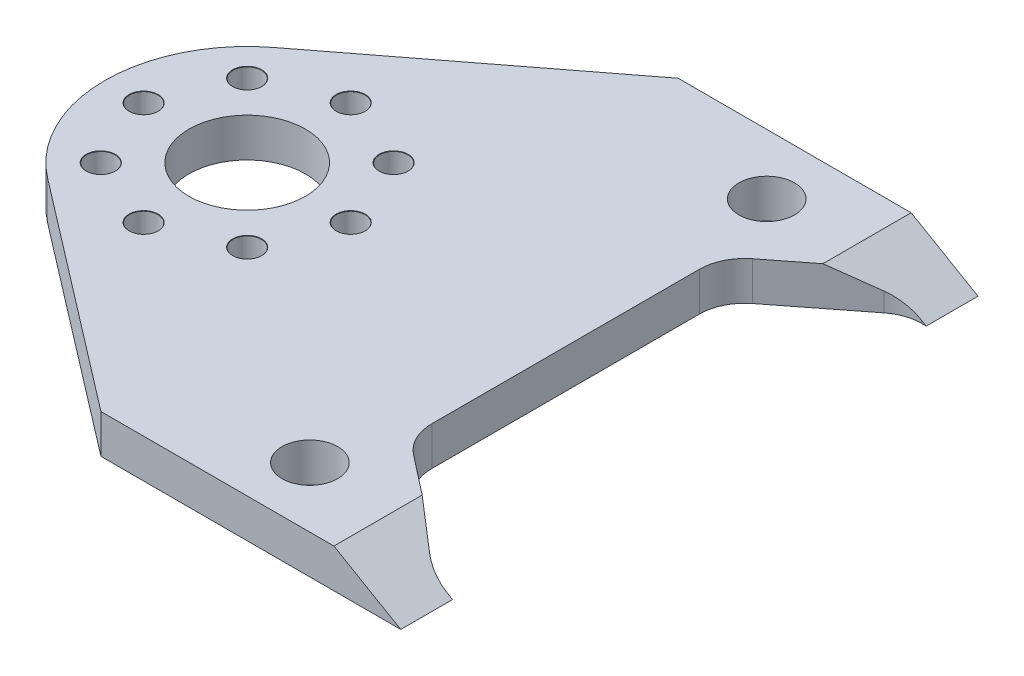
ISO-10303-21;
HEADER;
FILE_DESCRIPTION(('STEP AP214'),'2;1');
FILE_NAME('part.step','',(''),(''),'','','');
FILE_SCHEMA(('AUTOMOTIVE_DESIGN { 1 0 10303 214 1 1 1 1 }'));
ENDSEC;
DATA;
#1=APPLICATION_CONTEXT('core data for automotive mechanical design processes');
#2=APPLICATION_PROTOCOL_DEFINITION('international standard','automotive_design',2000,#1);
#3=PRODUCT_CONTEXT('',#1,'mechanical');
#4=PRODUCT('Part','Part','',(#3));
#5=PRODUCT_RELATED_PRODUCT_CATEGORY('part','',(#4));
#6=PRODUCT_DEFINITION_FORMATION('','',#4);
#7=PRODUCT_DEFINITION_CONTEXT('part definition',#1,'design');
#8=PRODUCT_DEFINITION('design','',#6,#7);
#9=PRODUCT_DEFINITION_SHAPE('','',#8);
#10=(LENGTH_UNIT() NAMED_UNIT(*) SI_UNIT(.MILLI.,.METRE.));
#11=(NAMED_UNIT(*) PLANE_ANGLE_UNIT() SI_UNIT($,.RADIAN.));
#12=(NAMED_UNIT(*) SI_UNIT($,.STERADIAN.) SOLID_ANGLE_UNIT());
#13=UNCERTAINTY_MEASURE_WITH_UNIT(LENGTH_MEASURE(1.E-05),#10,'distance_accuracy_value','');
#14=(GEOMETRIC_REPRESENTATION_CONTEXT(3) GLOBAL_UNCERTAINTY_ASSIGNED_CONTEXT((#13)) GLOBAL_UNIT_ASSIGNED_CONTEXT((#10,
#11,#12)) REPRESENTATION_CONTEXT('',''));
#15=CARTESIAN_POINT('',(0.,0.,0.));
#16=DIRECTION('',(0.,0.,1.));
#17=DIRECTION('',(1.,0.,0.));
#18=AXIS2_PLACEMENT_3D('',#15,#16,#17);
#19=CARTESIAN_POINT('',(0.,45.5,0.));
#20=DIRECTION('',(0.,-1.,0.));
#21=DIRECTION('',(0.,0.,-1.));
#22=AXIS2_PLACEMENT_3D('',#19,#20,#21);
#23=PLANE('',#22);
#24=CARTESIAN_POINT('',(-116.7,45.5,0.));
#25=DIRECTION('',(0.,-1.,0.));
#26=DIRECTION('',(0.,0.,-1.));
#27=AXIS2_PLACEMENT_3D('',#24,#25,#26);
#28=CIRCLE('',#27,4.5);
#29=CARTESIAN_POINT('',(-116.7,45.5,-4.5));
#30=VERTEX_POINT('',#29);
#31=EDGE_CURVE('E200',#30,#30,#28,.F.);
#32=ORIENTED_EDGE('',*,*,#31,.T.);
#33=EDGE_LOOP('',(#32));
#34=FACE_BOUND('',#33,.T.);
#35=DIRECTION('',(-1.,0.,0.));
#36=VECTOR('',#35,1.);
#37=CARTESIAN_POINT('',(0.,45.5,-22.3000000000002));
#38=LINE('',#37,#36);
#39=CARTESIAN_POINT('',(-82.5347874937353,45.5,-22.3000000000002));
#40=VERTEX_POINT('',#39);
#41=CARTESIAN_POINT('',(-105.7,45.5,-22.3000000000002));
#42=VERTEX_POINT('',#41);
#43=EDGE_CURVE('E169',#40,#42,#38,.T.);
#44=ORIENTED_EDGE('',*,*,#43,.F.);
#45=DIRECTION('',(0.,0.,1.));
#46=VECTOR('',#45,1.);
#47=CARTESIAN_POINT('',(-82.5347874937353,45.5,32.5));
#48=LINE('',#47,#46);
#49=CARTESIAN_POINT('',(-82.5347874937353,45.5,-18.2999999999999));
#50=VERTEX_POINT('',#49);
#51=EDGE_CURVE('E186',#40,#50,#48,.T.);
#52=ORIENTED_EDGE('',*,*,#51,.T.);
#53=DIRECTION('',(1.,0.,0.));
#54=VECTOR('',#53,1.);
#55=CARTESIAN_POINT('',(-49.7126326330275,45.5,-18.3));
#56=LINE('',#55,#54);
#57=CARTESIAN_POINT('',(-82.8873673669726,45.5,-18.2999999999999));
#58=VERTEX_POINT('',#57);
#59=EDGE_CURVE('E359',#58,#50,#56,.T.);
#60=ORIENTED_EDGE('',*,*,#59,.F.);
#61=CARTESIAN_POINT('',(-82.8873673669726,45.5,-14.7999999999999));
#62=DIRECTION('',(0.,-1.,0.));
#63=DIRECTION('',(0.,0.,-1.));
#64=AXIS2_PLACEMENT_3D('',#61,#62,#63);
#65=CIRCLE('',#64,3.5);
#66=CARTESIAN_POINT('',(-85.0421825306124,45.5,-17.5580376376235));
#67=VERTEX_POINT('',#66);
#68=EDGE_CURVE('E357',#67,#58,#65,.T.);
#69=ORIENTED_EDGE('',*,*,#68,.F.);
#70=DIRECTION('',(0.78801075360672,0.,-0.615661475325661));
#71=VECTOR('',#70,1.);
#72=CARTESIAN_POINT('',(-85.0421825306124,45.5,-17.5580376376235));
#73=LINE('',#72,#71);
#74=CARTESIAN_POINT('',(-90.7548151636398,45.5,-13.0948398719258));
#75=VERTEX_POINT('',#74);
#76=EDGE_CURVE('E355',#75,#67,#73,.T.);
#77=ORIENTED_EDGE('',*,*,#76,.F.);
#78=CARTESIAN_POINT('',(-88.6,45.5,-10.3368022343023));
#79=DIRECTION('',(0.,-1.,0.));
#80=DIRECTION('',(0.,0.,-1.));
#81=AXIS2_PLACEMENT_3D('',#78,#79,#80);
#82=CIRCLE('',#81,3.5);
#83=CARTESIAN_POINT('',(-92.1,45.5,-10.3368022343023));
#84=VERTEX_POINT('',#83);
#85=EDGE_CURVE('E353',#84,#75,#82,.T.);
#86=ORIENTED_EDGE('',*,*,#85,.F.);
#87=DIRECTION('',(0.,0.,-1.));
#88=VECTOR('',#87,1.);
#89=CARTESIAN_POINT('',(-92.1,45.5,-10.3368022343023));
#90=LINE('',#89,#88);
#91=CARTESIAN_POINT('',(-92.0999999999999,45.5,10.3368022343025));
#92=VERTEX_POINT('',#91);
#93=EDGE_CURVE('E351',#92,#84,#90,.T.);
#94=ORIENTED_EDGE('',*,*,#93,.F.);
#95=CARTESIAN_POINT('',(-88.6,45.5,10.3368022343025));
#96=DIRECTION('',(0.,-1.,0.));
#97=DIRECTION('',(0.,0.,-1.));
#98=AXIS2_PLACEMENT_3D('',#95,#96,#97);
#99=CIRCLE('',#98,3.49999999999999);
#100=CARTESIAN_POINT('',(-90.7548151636397,45.5,13.094839871926));
#101=VERTEX_POINT('',#100);
#102=EDGE_CURVE('E349',#101,#92,#99,.T.);
#103=ORIENTED_EDGE('',*,*,#102,.F.);
#104=DIRECTION('',(-0.788010753606724,0.,-0.615661475325656));
#105=VECTOR('',#104,1.);
#106=CARTESIAN_POINT('',(-90.7548151636398,45.5,13.094839871926));
#107=LINE('',#106,#105);
#108=CARTESIAN_POINT('',(-85.0421825306122,45.5,17.5580376376236));
#109=VERTEX_POINT('',#108);
#110=EDGE_CURVE('E347',#109,#101,#107,.T.);
#111=ORIENTED_EDGE('',*,*,#110,.F.);
#112=CARTESIAN_POINT('',(-82.8873673669724,45.5,14.8000000000001));
#113=DIRECTION('',(0.,-1.,0.));
#114=DIRECTION('',(0.,0.,-1.));
#115=AXIS2_PLACEMENT_3D('',#112,#113,#114);
#116=CIRCLE('',#115,3.5);
#117=CARTESIAN_POINT('',(-82.8873673669724,45.5,18.3000000000001));
#118=VERTEX_POINT('',#117);
#119=EDGE_CURVE('E185',#118,#109,#116,.T.);
#120=ORIENTED_EDGE('',*,*,#119,.F.);
#121=DIRECTION('',(-1.,0.,0.));
#122=VECTOR('',#121,1.);
#123=CARTESIAN_POINT('',(-82.8873673669724,45.5,18.3000000000001));
#124=LINE('',#123,#122);
#125=CARTESIAN_POINT('',(-82.5347874937353,45.5,18.3000000000001));
#126=VERTEX_POINT('',#125);
#127=EDGE_CURVE('E184',#126,#118,#124,.T.);
#128=ORIENTED_EDGE('',*,*,#127,.F.);
#129=DIRECTION('',(0.,0.,1.));
#130=VECTOR('',#129,1.);
#131=CARTESIAN_POINT('',(-82.5347874937353,45.5,32.5));
#132=LINE('',#131,#130);
#133=CARTESIAN_POINT('',(-82.5347874937353,45.5,22.3000000000001));
#134=VERTEX_POINT('',#133);
#135=EDGE_CURVE('E175',#126,#134,#132,.T.);
#136=ORIENTED_EDGE('',*,*,#135,.T.);
#137=DIRECTION('',(1.,0.,0.));
#138=VECTOR('',#137,1.);
#139=CARTESIAN_POINT('',(0.,45.5,22.2999999999998));
#140=LINE('',#139,#138);
#141=CARTESIAN_POINT('',(-105.7,45.5,22.3000000000001));
#142=VERTEX_POINT('',#141);
#143=EDGE_CURVE('E160',#142,#134,#140,.T.);
#144=ORIENTED_EDGE('',*,*,#143,.F.);
#145=DIRECTION('',(-0.793478788270874,0.,-0.608597907130961));
#146=VECTOR('',#145,1.);
#147=CARTESIAN_POINT('',(-105.7,45.5,22.3000000000001));
#148=LINE('',#147,#146);
#149=CARTESIAN_POINT('',(-123.39457697844,45.5,8.72826667097977));
#150=VERTEX_POINT('',#149);
#151=EDGE_CURVE('E255',#142,#150,#148,.T.);
#152=ORIENTED_EDGE('',*,*,#151,.T.);
#153=CARTESIAN_POINT('',(-116.7,45.5,0.));
#154=DIRECTION('',(0.,1.,0.));
#155=DIRECTION('',(0.,0.,1.));
#156=AXIS2_PLACEMENT_3D('',#153,#154,#155);
#157=CIRCLE('',#156,11.);
#158=CARTESIAN_POINT('',(-123.394576978441,45.5,-8.72826667097961));
#159=VERTEX_POINT('',#158);
#160=EDGE_CURVE('E327',#159,#150,#157,.T.);
#161=ORIENTED_EDGE('',*,*,#160,.F.);
#162=DIRECTION('',(0.793478788270873,0.,-0.608597907130962));
#163=VECTOR('',#162,1.);
#164=CARTESIAN_POINT('',(-105.7,45.5,-22.3000000000002));
#165=LINE('',#164,#163);
#166=EDGE_CURVE('E257',#159,#42,#165,.T.);
#167=ORIENTED_EDGE('',*,*,#166,.T.);
#168=EDGE_LOOP('',(#44,#52,#60,#69,#77,#86,#94,#103,#111,#120,#128,#136,#144,#152,#161,#167));
#169=FACE_BOUND('',#168,.T.);
#170=CARTESIAN_POINT('',(-94.2078962198904,45.5,-17.6479012936033));
#171=DIRECTION('',(0.,-1.,0.));
#172=DIRECTION('',(0.,0.,-1.));
#173=AXIS2_PLACEMENT_3D('',#170,#171,#172);
#174=CIRCLE('',#173,2.14999999999999);
#175=CARTESIAN_POINT('',(-94.2078962198904,45.5,-19.7979012936033));
#176=VERTEX_POINT('',#175);
#177=EDGE_CURVE('E197',#176,#176,#174,.F.);
#178=ORIENTED_EDGE('',*,*,#177,.T.);
#179=EDGE_LOOP('',(#178));
#180=FACE_BOUND('',#179,.T.);
#181=CARTESIAN_POINT('',(-94.2078962198904,45.5,17.6479012936032));
#182=DIRECTION('',(0.,-1.,0.));
#183=DIRECTION('',(0.,0.,-1.));
#184=AXIS2_PLACEMENT_3D('',#181,#182,#183);
#185=CIRCLE('',#184,2.14999999999999);
#186=CARTESIAN_POINT('',(-94.2078962198904,45.5,15.4979012936032));
#187=VERTEX_POINT('',#186);
#188=EDGE_CURVE('E191',#187,#187,#185,.F.);
#189=ORIENTED_EDGE('',*,*,#188,.T.);
#190=EDGE_LOOP('',(#189));
#191=FACE_BOUND('',#190,.T.);
#192=CARTESIAN_POINT('',(-111.043145750508,45.5,-5.65685424949238));
#193=DIRECTION('',(0.,1.,0.));
#194=DIRECTION('',(0.,0.,1.));
#195=AXIS2_PLACEMENT_3D('',#192,#193,#194);
#196=CIRCLE('',#195,1.09999999999999);
#197=CARTESIAN_POINT('',(-111.043145750508,45.5,-4.55685424949239));
#198=VERTEX_POINT('',#197);
#199=EDGE_CURVE('E325',#198,#198,#196,.T.);
#200=ORIENTED_EDGE('',*,*,#199,.T.);
#201=EDGE_LOOP('',(#200));
#202=FACE_BOUND('',#201,.T.);
#203=CARTESIAN_POINT('',(-108.7,45.5,0.));
#204=DIRECTION('',(0.,1.,0.));
#205=DIRECTION('',(0.,0.,1.));
#206=AXIS2_PLACEMENT_3D('',#203,#204,#205);
#207=CIRCLE('',#206,1.09999999999999);
#208=CARTESIAN_POINT('',(-108.7,45.5,1.09999999999999));
#209=VERTEX_POINT('',#208);
#210=EDGE_CURVE('E318',#209,#209,#207,.T.);
#211=ORIENTED_EDGE('',*,*,#210,.T.);
#212=EDGE_LOOP('',(#211));
#213=FACE_BOUND('',#212,.T.);
#214=CARTESIAN_POINT('',(-111.043145750508,45.5,5.65685424949238));
#215=DIRECTION('',(0.,1.,0.));
#216=DIRECTION('',(0.,0.,1.));
#217=AXIS2_PLACEMENT_3D('',#214,#215,#216);
#218=CIRCLE('',#217,1.09999999999999);
#219=CARTESIAN_POINT('',(-111.043145750508,45.5,6.75685424949237));
#220=VERTEX_POINT('',#219);
#221=EDGE_CURVE('E311',#220,#220,#218,.T.);
#222=ORIENTED_EDGE('',*,*,#221,.T.);
#223=EDGE_LOOP('',(#222));
#224=FACE_BOUND('',#223,.T.);
#225=CARTESIAN_POINT('',(-116.7,45.5,8.));
#226=DIRECTION('',(0.,1.,0.));
#227=DIRECTION('',(0.,0.,1.));
#228=AXIS2_PLACEMENT_3D('',#225,#226,#227);
#229=CIRCLE('',#228,1.09999999999999);
#230=CARTESIAN_POINT('',(-116.7,45.5,9.09999999999999));
#231=VERTEX_POINT('',#230);
#232=EDGE_CURVE('E304',#231,#231,#229,.T.);
#233=ORIENTED_EDGE('',*,*,#232,.T.);
#234=EDGE_LOOP('',(#233));
#235=FACE_BOUND('',#234,.T.);
#236=CARTESIAN_POINT('',(-122.356854249492,45.5,5.65685424949238));
#237=DIRECTION('',(0.,1.,0.));
#238=DIRECTION('',(0.,0.,1.));
#239=AXIS2_PLACEMENT_3D('',#236,#237,#238);
#240=CIRCLE('',#239,1.09999999999999);
#241=CARTESIAN_POINT('',(-122.356854249492,45.5,6.75685424949237));
#242=VERTEX_POINT('',#241);
#243=EDGE_CURVE('E297',#242,#242,#240,.T.);
#244=ORIENTED_EDGE('',*,*,#243,.T.);
#245=EDGE_LOOP('',(#244));
#246=FACE_BOUND('',#245,.T.);
#247=CARTESIAN_POINT('',(-124.7,45.5,0.));
#248=DIRECTION('',(0.,1.,0.));
#249=DIRECTION('',(0.,0.,1.));
#250=AXIS2_PLACEMENT_3D('',#247,#248,#249);
#251=CIRCLE('',#250,1.09999999999999);
#252=CARTESIAN_POINT('',(-124.7,45.5,1.09999999999999));
#253=VERTEX_POINT('',#252);
#254=EDGE_CURVE('E290',#253,#253,#251,.T.);
#255=ORIENTED_EDGE('',*,*,#254,.T.);
#256=EDGE_LOOP('',(#255));
#257=FACE_BOUND('',#256,.T.);
#258=CARTESIAN_POINT('',(-122.356854249492,45.5,-5.65685424949238));
#259=DIRECTION('',(0.,1.,0.));
#260=DIRECTION('',(0.,0.,1.));
#261=AXIS2_PLACEMENT_3D('',#258,#259,#260);
#262=CIRCLE('',#261,1.09999999999999);
#263=CARTESIAN_POINT('',(-122.356854249492,45.5,-4.55685424949239));
#264=VERTEX_POINT('',#263);
#265=EDGE_CURVE('E283',#264,#264,#262,.T.);
#266=ORIENTED_EDGE('',*,*,#265,.T.);
#267=EDGE_LOOP('',(#266));
#268=FACE_BOUND('',#267,.T.);
#269=CARTESIAN_POINT('',(-116.7,45.5,-8.));
#270=DIRECTION('',(0.,1.,0.));
#271=DIRECTION('',(0.,0.,1.));
#272=AXIS2_PLACEMENT_3D('',#269,#270,#271);
#273=CIRCLE('',#272,1.09999999999999);
#274=CARTESIAN_POINT('',(-116.7,45.5,-6.90000000000001));
#275=VERTEX_POINT('',#274);
#276=EDGE_CURVE('E276',#275,#275,#273,.T.);
#277=ORIENTED_EDGE('',*,*,#276,.T.);
#278=EDGE_LOOP('',(#277));
#279=FACE_BOUND('',#278,.T.);
#280=ADVANCED_FACE('F45',(#34,#169,#180,#191,#202,#213,#224,#235,#246,#257,#268,#279),#23,.T.);
#281=CARTESIAN_POINT('',(-111.043145750508,48.5,-5.65685424949238));
#282=DIRECTION('',(0.,1.,0.));
#283=DIRECTION('',(0.,0.,1.));
#284=AXIS2_PLACEMENT_3D('',#281,#282,#283);
#285=CONICAL_SURFACE('',#284,1.125,0.785398163397726);
#286=CARTESIAN_POINT('',(-111.043145750508,48.475,-5.65685424949238));
#287=DIRECTION('',(0.,1.,0.));
#288=DIRECTION('',(0.,0.,1.));
#289=AXIS2_PLACEMENT_3D('',#286,#287,#288);
#290=CIRCLE('',#289,1.09999999999999);
#291=CARTESIAN_POINT('',(-111.043145750508,48.475,-4.55685424949239));
#292=VERTEX_POINT('',#291);
#293=EDGE_CURVE('E322',#292,#292,#290,.T.);
#294=ORIENTED_EDGE('',*,*,#293,.F.);
#295=EDGE_LOOP('',(#294));
#296=FACE_BOUND('',#295,.T.);
#297=CARTESIAN_POINT('',(-111.043145750508,48.5,-5.65685424949238));
#298=DIRECTION('',(0.,1.,0.));
#299=DIRECTION('',(0.,0.,1.));
#300=AXIS2_PLACEMENT_3D('',#297,#298,#299);
#301=CIRCLE('',#300,1.125);
#302=CARTESIAN_POINT('',(-111.043145750508,48.5,-4.53185424949238));
#303=VERTEX_POINT('',#302);
#304=EDGE_CURVE('E319',#303,#303,#301,.T.);
#305=ORIENTED_EDGE('',*,*,#304,.T.);
#306=EDGE_LOOP('',(#305));
#307=FACE_BOUND('',#306,.T.);
#308=ADVANCED_FACE('F410',(#296,#307),#285,.F.);
#309=CARTESIAN_POINT('',(-111.043145750508,48.5,-5.65685424949238));
#310=DIRECTION('',(0.,1.,0.));
#311=DIRECTION('',(0.,0.,1.));
#312=AXIS2_PLACEMENT_3D('',#309,#310,#311);
#313=CYLINDRICAL_SURFACE('',#312,1.09999999999999);
#314=ORIENTED_EDGE('',*,*,#293,.T.);
#315=EDGE_LOOP('',(#314));
#316=FACE_BOUND('',#315,.T.);
#317=ORIENTED_EDGE('',*,*,#199,.F.);
#318=EDGE_LOOP('',(#317));
#319=FACE_BOUND('',#318,.T.);
#320=ADVANCED_FACE('F412',(#316,#319),#313,.F.);
#321=CARTESIAN_POINT('',(-108.7,48.5,0.));
#322=DIRECTION('',(0.,1.,0.));
#323=DIRECTION('',(0.,0.,1.));
#324=AXIS2_PLACEMENT_3D('',#321,#322,#323);
#325=CONICAL_SURFACE('',#324,1.125,0.785398163397726);
#326=CARTESIAN_POINT('',(-108.7,48.475,0.));
#327=DIRECTION('',(0.,1.,0.));
#328=DIRECTION('',(0.,0.,1.));
#329=AXIS2_PLACEMENT_3D('',#326,#327,#328);
#330=CIRCLE('',#329,1.09999999999999);
#331=CARTESIAN_POINT('',(-108.7,48.475,1.09999999999999));
#332=VERTEX_POINT('',#331);
#333=EDGE_CURVE('E315',#332,#332,#330,.T.);
#334=ORIENTED_EDGE('',*,*,#333,.F.);
#335=EDGE_LOOP('',(#334));
#336=FACE_BOUND('',#335,.T.);
#337=CARTESIAN_POINT('',(-108.7,48.5,0.));
#338=DIRECTION('',(0.,1.,0.));
#339=DIRECTION('',(0.,0.,1.));
#340=AXIS2_PLACEMENT_3D('',#337,#338,#339);
#341=CIRCLE('',#340,1.125);
#342=CARTESIAN_POINT('',(-108.7,48.5,1.125));
#343=VERTEX_POINT('',#342);
#344=EDGE_CURVE('E312',#343,#343,#341,.T.);
#345=ORIENTED_EDGE('',*,*,#344,.T.);
#346=EDGE_LOOP('',(#345));
#347=FACE_BOUND('',#346,.T.);
#348=ADVANCED_FACE('F420',(#336,#347),#325,.F.);
#349=CARTESIAN_POINT('',(-108.7,48.5,0.));
#350=DIRECTION('',(0.,1.,0.));
#351=DIRECTION('',(0.,0.,1.));
#352=AXIS2_PLACEMENT_3D('',#349,#350,#351);
#353=CYLINDRICAL_SURFACE('',#352,1.09999999999999);
#354=ORIENTED_EDGE('',*,*,#333,.T.);
#355=EDGE_LOOP('',(#354));
#356=FACE_BOUND('',#355,.T.);
#357=ORIENTED_EDGE('',*,*,#210,.F.);
#358=EDGE_LOOP('',(#357));
#359=FACE_BOUND('',#358,.T.);
#360=ADVANCED_FACE('F428',(#356,#359),#353,.F.);
#361=CARTESIAN_POINT('',(-111.043145750508,48.5,5.65685424949238));
#362=DIRECTION('',(0.,1.,0.));
#363=DIRECTION('',(0.,0.,1.));
#364=AXIS2_PLACEMENT_3D('',#361,#362,#363);
#365=CONICAL_SURFACE('',#364,1.125,0.785398163397726);
#366=CARTESIAN_POINT('',(-111.043145750508,48.475,5.65685424949238));
#367=DIRECTION('',(0.,1.,0.));
#368=DIRECTION('',(0.,0.,1.));
#369=AXIS2_PLACEMENT_3D('',#366,#367,#368);
#370=CIRCLE('',#369,1.09999999999999);
#371=CARTESIAN_POINT('',(-111.043145750508,48.475,6.75685424949237));
#372=VERTEX_POINT('',#371);
#373=EDGE_CURVE('E308',#372,#372,#370,.T.);
#374=ORIENTED_EDGE('',*,*,#373,.F.);
#375=EDGE_LOOP('',(#374));
#376=FACE_BOUND('',#375,.T.);
#377=CARTESIAN_POINT('',(-111.043145750508,48.5,5.65685424949238));
#378=DIRECTION('',(0.,1.,0.));
#379=DIRECTION('',(0.,0.,1.));
#380=AXIS2_PLACEMENT_3D('',#377,#378,#379);
#381=CIRCLE('',#380,1.125);
#382=CARTESIAN_POINT('',(-111.043145750508,48.5,6.78185424949238));
#383=VERTEX_POINT('',#382);
#384=EDGE_CURVE('E305',#383,#383,#381,.T.);
#385=ORIENTED_EDGE('',*,*,#384,.T.);
#386=EDGE_LOOP('',(#385));
#387=FACE_BOUND('',#386,.T.);
#388=ADVANCED_FACE('F705',(#376,#387),#365,.F.);
#389=CARTESIAN_POINT('',(-111.043145750508,48.5,5.65685424949238));
#390=DIRECTION('',(0.,1.,0.));
#391=DIRECTION('',(0.,0.,1.));
#392=AXIS2_PLACEMENT_3D('',#389,#390,#391);
#393=CYLINDRICAL_SURFACE('',#392,1.09999999999999);
#394=ORIENTED_EDGE('',*,*,#373,.T.);
#395=EDGE_LOOP('',(#394));
#396=FACE_BOUND('',#395,.T.);
#397=ORIENTED_EDGE('',*,*,#221,.F.);
#398=EDGE_LOOP('',(#397));
#399=FACE_BOUND('',#398,.T.);
#400=ADVANCED_FACE('F715',(#396,#399),#393,.F.);
#401=CARTESIAN_POINT('',(-116.7,48.5,8.));
#402=DIRECTION('',(0.,1.,0.));
#403=DIRECTION('',(0.,0.,1.));
#404=AXIS2_PLACEMENT_3D('',#401,#402,#403);
#405=CONICAL_SURFACE('',#404,1.125,0.785398163397726);
#406=CARTESIAN_POINT('',(-116.7,48.475,8.));
#407=DIRECTION('',(0.,1.,0.));
#408=DIRECTION('',(0.,0.,1.));
#409=AXIS2_PLACEMENT_3D('',#406,#407,#408);
#410=CIRCLE('',#409,1.09999999999999);
#411=CARTESIAN_POINT('',(-116.7,48.475,9.09999999999999));
#412=VERTEX_POINT('',#411);
#413=EDGE_CURVE('E301',#412,#412,#410,.T.);
#414=ORIENTED_EDGE('',*,*,#413,.F.);
#415=EDGE_LOOP('',(#414));
#416=FACE_BOUND('',#415,.T.);
#417=CARTESIAN_POINT('',(-116.7,48.5,8.));
#418=DIRECTION('',(0.,1.,0.));
#419=DIRECTION('',(0.,0.,1.));
#420=AXIS2_PLACEMENT_3D('',#417,#418,#419);
#421=CIRCLE('',#420,1.125);
#422=CARTESIAN_POINT('',(-116.7,48.5,9.125));
#423=VERTEX_POINT('',#422);
#424=EDGE_CURVE('E298',#423,#423,#421,.T.);
#425=ORIENTED_EDGE('',*,*,#424,.T.);
#426=EDGE_LOOP('',(#425));
#427=FACE_BOUND('',#426,.T.);
#428=ADVANCED_FACE('F726',(#416,#427),#405,.F.);
#429=CARTESIAN_POINT('',(-116.7,48.5,8.));
#430=DIRECTION('',(0.,1.,0.));
#431=DIRECTION('',(0.,0.,1.));
#432=AXIS2_PLACEMENT_3D('',#429,#430,#431);
#433=CYLINDRICAL_SURFACE('',#432,1.09999999999999);
#434=ORIENTED_EDGE('',*,*,#413,.T.);
#435=EDGE_LOOP('',(#434));
#436=FACE_BOUND('',#435,.T.);
#437=ORIENTED_EDGE('',*,*,#232,.F.);
#438=EDGE_LOOP('',(#437));
#439=FACE_BOUND('',#438,.T.);
#440=ADVANCED_FACE('F737',(#436,#439),#433,.F.);
#441=CARTESIAN_POINT('',(-122.356854249492,48.5,5.65685424949238));
#442=DIRECTION('',(0.,1.,0.));
#443=DIRECTION('',(0.,0.,1.));
#444=AXIS2_PLACEMENT_3D('',#441,#442,#443);
#445=CONICAL_SURFACE('',#444,1.125,0.785398163397726);
#446=CARTESIAN_POINT('',(-122.356854249492,48.475,5.65685424949238));
#447=DIRECTION('',(0.,1.,0.));
#448=DIRECTION('',(0.,0.,1.));
#449=AXIS2_PLACEMENT_3D('',#446,#447,#448);
#450=CIRCLE('',#449,1.09999999999999);
#451=CARTESIAN_POINT('',(-122.356854249492,48.475,6.75685424949237));
#452=VERTEX_POINT('',#451);
#453=EDGE_CURVE('E294',#452,#452,#450,.T.);
#454=ORIENTED_EDGE('',*,*,#453,.F.);
#455=EDGE_LOOP('',(#454));
#456=FACE_BOUND('',#455,.T.);
#457=CARTESIAN_POINT('',(-122.356854249492,48.5,5.65685424949238));
#458=DIRECTION('',(0.,1.,0.));
#459=DIRECTION('',(0.,0.,1.));
#460=AXIS2_PLACEMENT_3D('',#457,#458,#459);
#461=CIRCLE('',#460,1.125);
#462=CARTESIAN_POINT('',(-122.356854249492,48.5,6.78185424949238));
#463=VERTEX_POINT('',#462);
#464=EDGE_CURVE('E291',#463,#463,#461,.T.);
#465=ORIENTED_EDGE('',*,*,#464,.T.);
#466=EDGE_LOOP('',(#465));
#467=FACE_BOUND('',#466,.T.);
#468=ADVANCED_FACE('F748',(#456,#467),#445,.F.);
#469=CARTESIAN_POINT('',(-122.356854249492,48.5,5.65685424949238));
#470=DIRECTION('',(0.,1.,0.));
#471=DIRECTION('',(0.,0.,1.));
#472=AXIS2_PLACEMENT_3D('',#469,#470,#471);
#473=CYLINDRICAL_SURFACE('',#472,1.09999999999999);
#474=ORIENTED_EDGE('',*,*,#453,.T.);
#475=EDGE_LOOP('',(#474));
#476=FACE_BOUND('',#475,.T.);
#477=ORIENTED_EDGE('',*,*,#243,.F.);
#478=EDGE_LOOP('',(#477));
#479=FACE_BOUND('',#478,.T.);
#480=ADVANCED_FACE('F759',(#476,#479),#473,.F.);
#481=CARTESIAN_POINT('',(-124.7,48.5,0.));
#482=DIRECTION('',(0.,1.,0.));
#483=DIRECTION('',(0.,0.,1.));
#484=AXIS2_PLACEMENT_3D('',#481,#482,#483);
#485=CONICAL_SURFACE('',#484,1.125,0.785398163397726);
#486=CARTESIAN_POINT('',(-124.7,48.475,0.));
#487=DIRECTION('',(0.,1.,0.));
#488=DIRECTION('',(0.,0.,1.));
#489=AXIS2_PLACEMENT_3D('',#486,#487,#488);
#490=CIRCLE('',#489,1.09999999999999);
#491=CARTESIAN_POINT('',(-124.7,48.475,1.09999999999999));
#492=VERTEX_POINT('',#491);
#493=EDGE_CURVE('E287',#492,#492,#490,.T.);
#494=ORIENTED_EDGE('',*,*,#493,.F.);
#495=EDGE_LOOP('',(#494));
#496=FACE_BOUND('',#495,.T.);
#497=CARTESIAN_POINT('',(-124.7,48.5,0.));
#498=DIRECTION('',(0.,1.,0.));
#499=DIRECTION('',(0.,0.,1.));
#500=AXIS2_PLACEMENT_3D('',#497,#498,#499);
#501=CIRCLE('',#500,1.125);
#502=CARTESIAN_POINT('',(-124.7,48.5,1.125));
#503=VERTEX_POINT('',#502);
#504=EDGE_CURVE('E284',#503,#503,#501,.T.);
#505=ORIENTED_EDGE('',*,*,#504,.T.);
#506=EDGE_LOOP('',(#505));
#507=FACE_BOUND('',#506,.T.);
#508=ADVANCED_FACE('F770',(#496,#507),#485,.F.);
#509=CARTESIAN_POINT('',(-124.7,48.5,0.));
#510=DIRECTION('',(0.,1.,0.));
#511=DIRECTION('',(0.,0.,1.));
#512=AXIS2_PLACEMENT_3D('',#509,#510,#511);
#513=CYLINDRICAL_SURFACE('',#512,1.09999999999999);
#514=ORIENTED_EDGE('',*,*,#493,.T.);
#515=EDGE_LOOP('',(#514));
#516=FACE_BOUND('',#515,.T.);
#517=ORIENTED_EDGE('',*,*,#254,.F.);
#518=EDGE_LOOP('',(#517));
#519=FACE_BOUND('',#518,.T.);
#520=ADVANCED_FACE('F781',(#516,#519),#513,.F.);
#521=CARTESIAN_POINT('',(-122.356854249492,48.5,-5.65685424949238));
#522=DIRECTION('',(0.,1.,0.));
#523=DIRECTION('',(0.,0.,1.));
#524=AXIS2_PLACEMENT_3D('',#521,#522,#523);
#525=CONICAL_SURFACE('',#524,1.125,0.785398163397726);
#526=CARTESIAN_POINT('',(-122.356854249492,48.475,-5.65685424949238));
#527=DIRECTION('',(0.,1.,0.));
#528=DIRECTION('',(0.,0.,1.));
#529=AXIS2_PLACEMENT_3D('',#526,#527,#528);
#530=CIRCLE('',#529,1.09999999999999);
#531=CARTESIAN_POINT('',(-122.356854249492,48.475,-4.55685424949239));
#532=VERTEX_POINT('',#531);
#533=EDGE_CURVE('E280',#532,#532,#530,.T.);
#534=ORIENTED_EDGE('',*,*,#533,.F.);
#535=EDGE_LOOP('',(#534));
#536=FACE_BOUND('',#535,.T.);
#537=CARTESIAN_POINT('',(-122.356854249492,48.5,-5.65685424949238));
#538=DIRECTION('',(0.,1.,0.));
#539=DIRECTION('',(0.,0.,1.));
#540=AXIS2_PLACEMENT_3D('',#537,#538,#539);
#541=CIRCLE('',#540,1.125);
#542=CARTESIAN_POINT('',(-122.356854249492,48.5,-4.53185424949238));
#543=VERTEX_POINT('',#542);
#544=EDGE_CURVE('E277',#543,#543,#541,.T.);
#545=ORIENTED_EDGE('',*,*,#544,.T.);
#546=EDGE_LOOP('',(#545));
#547=FACE_BOUND('',#546,.T.);
#548=ADVANCED_FACE('F792',(#536,#547),#525,.F.);
#549=CARTESIAN_POINT('',(-122.356854249492,48.5,-5.65685424949238));
#550=DIRECTION('',(0.,1.,0.));
#551=DIRECTION('',(0.,0.,1.));
#552=AXIS2_PLACEMENT_3D('',#549,#550,#551);
#553=CYLINDRICAL_SURFACE('',#552,1.09999999999999);
#554=ORIENTED_EDGE('',*,*,#533,.T.);
#555=EDGE_LOOP('',(#554));
#556=FACE_BOUND('',#555,.T.);
#557=ORIENTED_EDGE('',*,*,#265,.F.);
#558=EDGE_LOOP('',(#557));
#559=FACE_BOUND('',#558,.T.);
#560=ADVANCED_FACE('F803',(#556,#559),#553,.F.);
#561=CARTESIAN_POINT('',(-116.7,48.5,-8.));
#562=DIRECTION('',(0.,1.,0.));
#563=DIRECTION('',(0.,0.,1.));
#564=AXIS2_PLACEMENT_3D('',#561,#562,#563);
#565=CONICAL_SURFACE('',#564,1.125,0.785398163397726);
#566=CARTESIAN_POINT('',(-116.7,48.475,-8.));
#567=DIRECTION('',(0.,1.,0.));
#568=DIRECTION('',(0.,0.,1.));
#569=AXIS2_PLACEMENT_3D('',#566,#567,#568);
#570=CIRCLE('',#569,1.09999999999999);
#571=CARTESIAN_POINT('',(-116.7,48.475,-6.90000000000001));
#572=VERTEX_POINT('',#571);
#573=EDGE_CURVE('E273',#572,#572,#570,.T.);
#574=ORIENTED_EDGE('',*,*,#573,.F.);
#575=EDGE_LOOP('',(#574));
#576=FACE_BOUND('',#575,.T.);
#577=CARTESIAN_POINT('',(-116.7,48.5,-8.));
#578=DIRECTION('',(0.,1.,0.));
#579=DIRECTION('',(0.,0.,1.));
#580=AXIS2_PLACEMENT_3D('',#577,#578,#579);
#581=CIRCLE('',#580,1.125);
#582=CARTESIAN_POINT('',(-116.7,48.5,-6.875));
#583=VERTEX_POINT('',#582);
#584=EDGE_CURVE('E270',#583,#583,#581,.T.);
#585=ORIENTED_EDGE('',*,*,#584,.T.);
#586=EDGE_LOOP('',(#585));
#587=FACE_BOUND('',#586,.T.);
#588=ADVANCED_FACE('F814',(#576,#587),#565,.F.);
#589=CARTESIAN_POINT('',(-116.7,48.5,-8.));
#590=DIRECTION('',(0.,1.,0.));
#591=DIRECTION('',(0.,0.,1.));
#592=AXIS2_PLACEMENT_3D('',#589,#590,#591);
#593=CYLINDRICAL_SURFACE('',#592,1.09999999999999);
#594=ORIENTED_EDGE('',*,*,#573,.T.);
#595=EDGE_LOOP('',(#594));
#596=FACE_BOUND('',#595,.T.);
#597=ORIENTED_EDGE('',*,*,#276,.F.);
#598=EDGE_LOOP('',(#597));
#599=FACE_BOUND('',#598,.T.);
#600=ADVANCED_FACE('F472',(#596,#599),#593,.F.);
#601=CARTESIAN_POINT('',(-88.6,48.5,-10.3368022343023));
#602=DIRECTION('',(0.,-1.,0.));
#603=DIRECTION('',(0.,0.,-1.));
#604=AXIS2_PLACEMENT_3D('',#601,#602,#603);
#605=CYLINDRICAL_SURFACE('',#604,3.5);
#606=DIRECTION('',(0.,-1.,0.));
#607=VECTOR('',#606,1.);
#608=CARTESIAN_POINT('',(-92.1,48.5,-10.3368022343023));
#609=LINE('',#608,#607);
#610=CARTESIAN_POINT('',(-92.1,48.5,-10.3368022343023));
#611=VERTEX_POINT('',#610);
#612=EDGE_CURVE('E222',#611,#84,#609,.T.);
#613=ORIENTED_EDGE('',*,*,#612,.T.);
#614=ORIENTED_EDGE('',*,*,#85,.T.);
#615=DIRECTION('',(0.,-1.,0.));
#616=VECTOR('',#615,1.);
#617=CARTESIAN_POINT('',(-90.7548151636398,48.5,-13.0948398719258));
#618=LINE('',#617,#616);
#619=CARTESIAN_POINT('',(-90.7548151636398,48.5,-13.0948398719258));
#620=VERTEX_POINT('',#619);
#621=EDGE_CURVE('E219',#620,#75,#618,.T.);
#622=ORIENTED_EDGE('',*,*,#621,.F.);
#623=CARTESIAN_POINT('',(-88.6,48.5,-10.3368022343023));
#624=DIRECTION('',(0.,1.,0.));
#625=DIRECTION('',(0.,0.,1.));
#626=AXIS2_PLACEMENT_3D('',#623,#624,#625);
#627=CIRCLE('',#626,3.5);
#628=EDGE_CURVE('E245',#620,#611,#627,.T.);
#629=ORIENTED_EDGE('',*,*,#628,.T.);
#630=EDGE_LOOP('',(#613,#614,#622,#629));
#631=FACE_BOUND('',#630,.T.);
#632=ADVANCED_FACE('F468',(#631),#605,.F.);
#633=CARTESIAN_POINT('',(-92.1,48.5,-10.3368022343023));
#634=DIRECTION('',(1.,0.,0.));
#635=DIRECTION('',(0.,0.,-1.));
#636=AXIS2_PLACEMENT_3D('',#633,#634,#635);
#637=PLANE('',#636);
#638=DIRECTION('',(0.,-1.,0.));
#639=VECTOR('',#638,1.);
#640=CARTESIAN_POINT('',(-92.0999999999999,48.5,10.3368022343025));
#641=LINE('',#640,#639);
#642=CARTESIAN_POINT('',(-92.0999999999999,48.5,10.3368022343025));
#643=VERTEX_POINT('',#642);
#644=EDGE_CURVE('E225',#643,#92,#641,.T.);
#645=ORIENTED_EDGE('',*,*,#644,.T.);
#646=ORIENTED_EDGE('',*,*,#93,.T.);
#647=ORIENTED_EDGE('',*,*,#612,.F.);
#648=DIRECTION('',(0.,0.,1.));
#649=VECTOR('',#648,1.);
#650=CARTESIAN_POINT('',(-92.1,48.5,-10.3368022343023));
#651=LINE('',#650,#649);
#652=EDGE_CURVE('E239',#611,#643,#651,.T.);
#653=ORIENTED_EDGE('',*,*,#652,.T.);
#654=EDGE_LOOP('',(#645,#646,#647,#653));
#655=FACE_BOUND('',#654,.T.);
#656=ADVANCED_FACE('F471',(#655),#637,.T.);
#657=CARTESIAN_POINT('',(-88.6,48.5,10.3368022343025));
#658=DIRECTION('',(0.,-1.,0.));
#659=DIRECTION('',(0.,0.,-1.));
#660=AXIS2_PLACEMENT_3D('',#657,#658,#659);
#661=CYLINDRICAL_SURFACE('',#660,3.49999999999999);
#662=DIRECTION('',(0.,-1.,0.));
#663=VECTOR('',#662,1.);
#664=CARTESIAN_POINT('',(-90.7548151636397,48.5,13.094839871926));
#665=LINE('',#664,#663);
#666=CARTESIAN_POINT('',(-90.7548151636397,48.5,13.094839871926));
#667=VERTEX_POINT('',#666);
#668=EDGE_CURVE('E227',#667,#101,#665,.T.);
#669=ORIENTED_EDGE('',*,*,#668,.T.);
#670=ORIENTED_EDGE('',*,*,#102,.T.);
#671=ORIENTED_EDGE('',*,*,#644,.F.);
#672=CARTESIAN_POINT('',(-88.6,48.5,10.3368022343025));
#673=DIRECTION('',(0.,1.,0.));
#674=DIRECTION('',(0.,0.,1.));
#675=AXIS2_PLACEMENT_3D('',#672,#673,#674);
#676=CIRCLE('',#675,3.49999999999999);
#677=EDGE_CURVE('E236',#643,#667,#676,.T.);
#678=ORIENTED_EDGE('',*,*,#677,.T.);
#679=EDGE_LOOP('',(#669,#670,#671,#678));
#680=FACE_BOUND('',#679,.T.);
#681=ADVANCED_FACE('F476',(#680),#661,.F.);
#682=CARTESIAN_POINT('',(-90.7548151636398,48.5,13.094839871926));
#683=DIRECTION('',(0.615661475325656,0.,-0.788010753606724));
#684=DIRECTION('',(-0.788010753606724,0.,-0.615661475325656));
#685=AXIS2_PLACEMENT_3D('',#682,#683,#684);
#686=PLANE('',#685);
#687=DIRECTION('',(0.,-1.,0.));
#688=VECTOR('',#687,1.);
#689=CARTESIAN_POINT('',(-85.0421825306122,48.5,17.5580376376236));
#690=LINE('',#689,#688);
#691=CARTESIAN_POINT('',(-85.0421825306122,46.9563166765177,17.5580376376236));
#692=VERTEX_POINT('',#691);
#693=EDGE_CURVE('E49',#692,#109,#690,.T.);
#694=ORIENTED_EDGE('',*,*,#693,.T.);
#695=ORIENTED_EDGE('',*,*,#110,.T.);
#696=ORIENTED_EDGE('',*,*,#668,.F.);
#697=DIRECTION('',(0.788010753606724,0.,0.615661475325656));
#698=VECTOR('',#697,1.);
#699=CARTESIAN_POINT('',(-90.7548151636398,48.5,13.094839871926));
#700=LINE('',#699,#698);
#701=CARTESIAN_POINT('',(-87.7,48.5,15.4815230509125));
#702=VERTEX_POINT('',#701);
#703=EDGE_CURVE('E232',#667,#702,#700,.T.);
#704=ORIENTED_EDGE('',*,*,#703,.T.);
#705=DIRECTION('',(0.716529130172654,-0.416166302530791,0.559813910377252));
#706=VECTOR('',#705,1.);
#707=CARTESIAN_POINT('',(-34.1782013326499,17.414077434896,57.2973350544993));
#708=LINE('',#707,#706);
#709=EDGE_CURVE('E368',#702,#692,#708,.T.);
#710=ORIENTED_EDGE('',*,*,#709,.T.);
#711=EDGE_LOOP('',(#694,#695,#696,#704,#710));
#712=FACE_BOUND('',#711,.T.);
#713=ADVANCED_FACE('F453',(#712),#686,.T.);
#714=CARTESIAN_POINT('',(-82.8873673669724,48.5,14.8000000000001));
#715=DIRECTION('',(0.,-1.,0.));
#716=DIRECTION('',(0.,0.,-1.));
#717=AXIS2_PLACEMENT_3D('',#714,#715,#716);
#718=CYLINDRICAL_SURFACE('',#717,3.5);
#719=DIRECTION('',(0.,-1.,0.));
#720=VECTOR('',#719,1.);
#721=CARTESIAN_POINT('',(-82.8873673669724,48.5,18.3000000000001));
#722=LINE('',#721,#720);
#723=CARTESIAN_POINT('',(-82.8873673669724,45.7047814331799,18.3000000000001));
#724=VERTEX_POINT('',#723);
#725=EDGE_CURVE('E209',#724,#118,#722,.T.);
#726=ORIENTED_EDGE('',*,*,#725,.T.);
#727=ORIENTED_EDGE('',*,*,#119,.T.);
#728=ORIENTED_EDGE('',*,*,#693,.F.);
#729=CARTESIAN_POINT('',(-82.8873673669724,45.7047814331799,14.8000000000001));
#730=DIRECTION('',(-0.502241228117933,-0.864727557545491,0.));
#731=DIRECTION('',(0.864727557545491,-0.502241228117933,0.));
#732=AXIS2_PLACEMENT_3D('',#729,#730,#731);
#733=ELLIPSE('',#732,4.0475175903202,3.5);
#734=EDGE_CURVE('E206',#692,#724,#733,.F.);
#735=ORIENTED_EDGE('',*,*,#734,.T.);
#736=EDGE_LOOP('',(#726,#727,#728,#735));
#737=FACE_BOUND('',#736,.T.);
#738=ADVANCED_FACE('F366',(#737),#718,.F.);
#739=CARTESIAN_POINT('',(-82.8873673669724,48.5,18.3000000000001));
#740=DIRECTION('',(0.,0.,-1.));
#741=DIRECTION('',(-1.,0.,0.));
#742=AXIS2_PLACEMENT_3D('',#739,#740,#741);
#743=PLANE('',#742);
#744=DIRECTION('',(0.864727557545491,-0.502241228117933,0.));
#745=VECTOR('',#744,1.);
#746=CARTESIAN_POINT('',(-19.6913686675153,9.00000000000002,18.2999999999999));
#747=LINE('',#746,#745);
#748=EDGE_CURVE('E203',#724,#126,#747,.T.);
#749=ORIENTED_EDGE('',*,*,#748,.T.);
#750=ORIENTED_EDGE('',*,*,#127,.T.);
#751=ORIENTED_EDGE('',*,*,#725,.F.);
#752=EDGE_LOOP('',(#749,#750,#751));
#753=FACE_BOUND('',#752,.T.);
#754=ADVANCED_FACE('F363',(#753),#743,.T.);
#755=CARTESIAN_POINT('',(-49.7126326330275,48.5,-18.3));
#756=DIRECTION('',(0.,0.,1.));
#757=DIRECTION('',(1.,0.,0.));
#758=AXIS2_PLACEMENT_3D('',#755,#756,#757);
#759=PLANE('',#758);
#760=DIRECTION('',(0.,-1.,0.));
#761=VECTOR('',#760,1.);
#762=CARTESIAN_POINT('',(-82.8873673669726,48.5,-18.2999999999999));
#763=LINE('',#762,#761);
#764=CARTESIAN_POINT('',(-82.8873673669726,45.7047814331799,-18.2999999999999));
#765=VERTEX_POINT('',#764);
#766=EDGE_CURVE('E212',#765,#58,#763,.T.);
#767=ORIENTED_EDGE('',*,*,#766,.T.);
#768=ORIENTED_EDGE('',*,*,#59,.T.);
#769=DIRECTION('',(-0.864727557545491,0.502241228117933,0.));
#770=VECTOR('',#769,1.);
#771=CARTESIAN_POINT('',(-19.6913686675154,9.00000000000007,-18.3000000000001));
#772=LINE('',#771,#770);
#773=EDGE_CURVE('E207',#50,#765,#772,.T.);
#774=ORIENTED_EDGE('',*,*,#773,.T.);
#775=EDGE_LOOP('',(#767,#768,#774));
#776=FACE_BOUND('',#775,.T.);
#777=ADVANCED_FACE('F456',(#776),#759,.T.);
#778=CARTESIAN_POINT('',(-82.8873673669726,48.5,-14.7999999999999));
#779=DIRECTION('',(0.,-1.,0.));
#780=DIRECTION('',(0.,0.,-1.));
#781=AXIS2_PLACEMENT_3D('',#778,#779,#780);
#782=CYLINDRICAL_SURFACE('',#781,3.5);
#783=DIRECTION('',(0.,-1.,0.));
#784=VECTOR('',#783,1.);
#785=CARTESIAN_POINT('',(-85.0421825306124,48.5,-17.5580376376235));
#786=LINE('',#785,#784);
#787=CARTESIAN_POINT('',(-85.0421825306124,46.9563166765177,-17.5580376376235));
#788=VERTEX_POINT('',#787);
#789=EDGE_CURVE('E216',#788,#67,#786,.T.);
#790=ORIENTED_EDGE('',*,*,#789,.T.);
#791=ORIENTED_EDGE('',*,*,#68,.T.);
#792=ORIENTED_EDGE('',*,*,#766,.F.);
#793=CARTESIAN_POINT('',(-82.8873673669726,45.7047814331799,-14.7999999999999));
#794=DIRECTION('',(-0.502241228117933,-0.864727557545491,0.));
#795=DIRECTION('',(0.864727557545491,-0.502241228117933,0.));
#796=AXIS2_PLACEMENT_3D('',#793,#794,#795);
#797=ELLIPSE('',#796,4.0475175903202,3.5);
#798=EDGE_CURVE('E205',#765,#788,#797,.F.);
#799=ORIENTED_EDGE('',*,*,#798,.T.);
#800=EDGE_LOOP('',(#790,#791,#792,#799));
#801=FACE_BOUND('',#800,.T.);
#802=ADVANCED_FACE('F459',(#801),#782,.F.);
#803=CARTESIAN_POINT('',(-85.0421825306124,48.5,-17.5580376376235));
#804=DIRECTION('',(0.615661475325661,0.,0.78801075360672));
#805=DIRECTION('',(0.78801075360672,0.,-0.615661475325661));
#806=AXIS2_PLACEMENT_3D('',#803,#804,#805);
#807=PLANE('',#806);
#808=ORIENTED_EDGE('',*,*,#621,.T.);
#809=ORIENTED_EDGE('',*,*,#76,.T.);
#810=ORIENTED_EDGE('',*,*,#789,.F.);
#811=DIRECTION('',(-0.716529130172651,0.416166302530789,0.559813910377257));
#812=VECTOR('',#811,1.);
#813=CARTESIAN_POINT('',(-60.2511946596261,32.5574969720515,-36.9268801281276));
#814=LINE('',#813,#812);
#815=CARTESIAN_POINT('',(-87.7,48.5,-15.4815230509125));
#816=VERTEX_POINT('',#815);
#817=EDGE_CURVE('E178',#788,#816,#814,.T.);
#818=ORIENTED_EDGE('',*,*,#817,.T.);
#819=DIRECTION('',(-0.78801075360672,0.,0.615661475325661));
#820=VECTOR('',#819,1.);
#821=CARTESIAN_POINT('',(-85.0421825306124,48.5,-17.5580376376235));
#822=LINE('',#821,#820);
#823=EDGE_CURVE('E247',#816,#620,#822,.T.);
#824=ORIENTED_EDGE('',*,*,#823,.T.);
#825=EDGE_LOOP('',(#808,#809,#810,#818,#824));
#826=FACE_BOUND('',#825,.T.);
#827=ADVANCED_FACE('F463',(#826),#807,.T.);
#828=CARTESIAN_POINT('',(-19.6913686675152,9.,32.5));
#829=DIRECTION('',(-0.502241228117933,-0.864727557545491,0.));
#830=DIRECTION('',(0.864727557545491,-0.502241228117933,0.));
#831=AXIS2_PLACEMENT_3D('',#828,#829,#830);
#832=PLANE('',#831);
#833=ORIENTED_EDGE('',*,*,#51,.F.);
#834=DIRECTION('',(-0.864727557545491,0.502241228117933,0.));
#835=VECTOR('',#834,1.);
#836=CARTESIAN_POINT('',(-19.6913686675152,9.,-22.3000000000002));
#837=LINE('',#836,#835);
#838=CARTESIAN_POINT('',(-87.7,48.5,-22.3000000000002));
#839=VERTEX_POINT('',#838);
#840=EDGE_CURVE('E179',#40,#839,#837,.T.);
#841=ORIENTED_EDGE('',*,*,#840,.T.);
#842=DIRECTION('',(0.,0.,-1.));
#843=VECTOR('',#842,1.);
#844=CARTESIAN_POINT('',(-87.7,48.5,32.5));
#845=LINE('',#844,#843);
#846=EDGE_CURVE('E213',#816,#839,#845,.T.);
#847=ORIENTED_EDGE('',*,*,#846,.F.);
#848=ORIENTED_EDGE('',*,*,#817,.F.);
#849=ORIENTED_EDGE('',*,*,#798,.F.);
#850=ORIENTED_EDGE('',*,*,#773,.F.);
#851=EDGE_LOOP('',(#833,#841,#847,#848,#849,#850));
#852=FACE_BOUND('',#851,.T.);
#853=ADVANCED_FACE('F443',(#852),#832,.F.);
#854=CARTESIAN_POINT('',(-49.9192548246811,0.,65.0838088096637));
#855=DIRECTION('',(-0.608597907130961,0.,0.793478788270874));
#856=DIRECTION('',(0.793478788270874,0.,0.608597907130961));
#857=AXIS2_PLACEMENT_3D('',#854,#855,#856);
#858=PLANE('',#857);
#859=ORIENTED_EDGE('',*,*,#151,.F.);
#860=DIRECTION('',(0.,1.,0.));
#861=VECTOR('',#860,1.);
#862=CARTESIAN_POINT('',(-105.7,-2.48185130282062,22.3000000000001));
#863=LINE('',#862,#861);
#864=CARTESIAN_POINT('',(-105.7,48.5,22.3000000000001));
#865=VERTEX_POINT('',#864);
#866=EDGE_CURVE('E165',#142,#865,#863,.T.);
#867=ORIENTED_EDGE('',*,*,#866,.T.);
#868=DIRECTION('',(0.793478788270874,0.,0.608597907130961));
#869=VECTOR('',#868,1.);
#870=CARTESIAN_POINT('',(-105.7,48.5,22.3000000000001));
#871=LINE('',#870,#869);
#872=CARTESIAN_POINT('',(-123.39457697844,48.5,8.72826667097977));
#873=VERTEX_POINT('',#872);
#874=EDGE_CURVE('E260',#873,#865,#871,.T.);
#875=ORIENTED_EDGE('',*,*,#874,.F.);
#876=DIRECTION('',(0.,1.,0.));
#877=VECTOR('',#876,1.);
#878=CARTESIAN_POINT('',(-123.394576978441,-2.48185130282062,8.72826667097962));
#879=LINE('',#878,#877);
#880=EDGE_CURVE('E62',#150,#873,#879,.T.);
#881=ORIENTED_EDGE('',*,*,#880,.F.);
#882=EDGE_LOOP('',(#859,#867,#875,#881));
#883=FACE_BOUND('',#882,.T.);
#884=ADVANCED_FACE('F386',(#883),#858,.T.);
#885=CARTESIAN_POINT('',(-116.7,48.5,0.));
#886=DIRECTION('',(0.,1.,0.));
#887=DIRECTION('',(0.,0.,1.));
#888=AXIS2_PLACEMENT_3D('',#885,#886,#887);
#889=PLANE('',#888);
#890=CARTESIAN_POINT('',(-116.7,48.5,0.));
#891=DIRECTION('',(0.,1.,0.));
#892=DIRECTION('',(0.,0.,1.));
#893=AXIS2_PLACEMENT_3D('',#890,#891,#892);
#894=CIRCLE('',#893,4.5);
#895=CARTESIAN_POINT('',(-116.7,48.5,4.5));
#896=VERTEX_POINT('',#895);
#897=EDGE_CURVE('E376',#896,#896,#894,.T.);
#898=ORIENTED_EDGE('',*,*,#897,.F.);
#899=EDGE_LOOP('',(#898));
#900=FACE_BOUND('',#899,.T.);
#901=CARTESIAN_POINT('',(-94.2078962198904,48.5,-17.6479012936033));
#902=DIRECTION('',(0.,1.,0.));
#903=DIRECTION('',(0.,0.,1.));
#904=AXIS2_PLACEMENT_3D('',#901,#902,#903);
#905=CIRCLE('',#904,2.14999999999999);
#906=CARTESIAN_POINT('',(-94.2078962198904,48.5,-15.4979012936033));
#907=VERTEX_POINT('',#906);
#908=EDGE_CURVE('E11',#907,#907,#905,.T.);
#909=ORIENTED_EDGE('',*,*,#908,.F.);
#910=EDGE_LOOP('',(#909));
#911=FACE_BOUND('',#910,.T.);
#912=CARTESIAN_POINT('',(-94.2078962198904,48.5,17.6479012936032));
#913=DIRECTION('',(0.,1.,0.));
#914=DIRECTION('',(0.,0.,1.));
#915=AXIS2_PLACEMENT_3D('',#912,#913,#914);
#916=CIRCLE('',#915,2.14999999999999);
#917=CARTESIAN_POINT('',(-94.2078962198904,48.5,19.7979012936032));
#918=VERTEX_POINT('',#917);
#919=EDGE_CURVE('E54',#918,#918,#916,.T.);
#920=ORIENTED_EDGE('',*,*,#919,.F.);
#921=EDGE_LOOP('',(#920));
#922=FACE_BOUND('',#921,.T.);
#923=CARTESIAN_POINT('',(-116.7,48.5,0.));
#924=DIRECTION('',(0.,1.,0.));
#925=DIRECTION('',(0.,0.,1.));
#926=AXIS2_PLACEMENT_3D('',#923,#924,#925);
#927=CIRCLE('',#926,11.);
#928=CARTESIAN_POINT('',(-123.394576978441,48.5,-8.72826667097961));
#929=VERTEX_POINT('',#928);
#930=EDGE_CURVE('E66',#929,#873,#927,.T.);
#931=ORIENTED_EDGE('',*,*,#930,.T.);
#932=ORIENTED_EDGE('',*,*,#874,.T.);
#933=DIRECTION('',(1.,0.,0.));
#934=VECTOR('',#933,1.);
#935=CARTESIAN_POINT('',(-87.7,48.5,22.3000000000001));
#936=LINE('',#935,#934);
#937=CARTESIAN_POINT('',(-87.7,48.5,22.3));
#938=VERTEX_POINT('',#937);
#939=EDGE_CURVE('E201',#865,#938,#936,.T.);
#940=ORIENTED_EDGE('',*,*,#939,.T.);
#941=EDGE_CURVE('E177',#938,#702,#845,.T.);
#942=ORIENTED_EDGE('',*,*,#941,.T.);
#943=ORIENTED_EDGE('',*,*,#703,.F.);
#944=ORIENTED_EDGE('',*,*,#677,.F.);
#945=ORIENTED_EDGE('',*,*,#652,.F.);
#946=ORIENTED_EDGE('',*,*,#628,.F.);
#947=ORIENTED_EDGE('',*,*,#823,.F.);
#948=ORIENTED_EDGE('',*,*,#846,.T.);
#949=DIRECTION('',(-1.,0.,0.));
#950=VECTOR('',#949,1.);
#951=CARTESIAN_POINT('',(-87.7,48.5,-22.3000000000002));
#952=LINE('',#951,#950);
#953=CARTESIAN_POINT('',(-105.7,48.5,-22.3000000000002));
#954=VERTEX_POINT('',#953);
#955=EDGE_CURVE('E168',#839,#954,#952,.T.);
#956=ORIENTED_EDGE('',*,*,#955,.T.);
#957=DIRECTION('',(-0.793478788270873,0.,0.608597907130962));
#958=VECTOR('',#957,1.);
#959=CARTESIAN_POINT('',(-105.7,48.5,-22.3000000000002));
#960=LINE('',#959,#958);
#961=EDGE_CURVE('E249',#954,#929,#960,.T.);
#962=ORIENTED_EDGE('',*,*,#961,.T.);
#963=EDGE_LOOP('',(#931,#932,#940,#942,#943,#944,#945,#946,#947,#948,#956,#962));
#964=FACE_BOUND('',#963,.T.);
#965=ORIENTED_EDGE('',*,*,#584,.F.);
#966=EDGE_LOOP('',(#965));
#967=FACE_BOUND('',#966,.T.);
#968=ORIENTED_EDGE('',*,*,#544,.F.);
#969=EDGE_LOOP('',(#968));
#970=FACE_BOUND('',#969,.T.);
#971=ORIENTED_EDGE('',*,*,#504,.F.);
#972=EDGE_LOOP('',(#971));
#973=FACE_BOUND('',#972,.T.);
#974=ORIENTED_EDGE('',*,*,#464,.F.);
#975=EDGE_LOOP('',(#974));
#976=FACE_BOUND('',#975,.T.);
#977=ORIENTED_EDGE('',*,*,#424,.F.);
#978=EDGE_LOOP('',(#977));
#979=FACE_BOUND('',#978,.T.);
#980=ORIENTED_EDGE('',*,*,#384,.F.);
#981=EDGE_LOOP('',(#980));
#982=FACE_BOUND('',#981,.T.);
#983=ORIENTED_EDGE('',*,*,#344,.F.);
#984=EDGE_LOOP('',(#983));
#985=FACE_BOUND('',#984,.T.);
#986=ORIENTED_EDGE('',*,*,#304,.F.);
#987=EDGE_LOOP('',(#986));
#988=FACE_BOUND('',#987,.T.);
#989=ADVANCED_FACE('F382',(#900,#911,#922,#964,#967,#970,#973,#976,#979,#982,#985,#988),#889,.T.);
#990=CARTESIAN_POINT('',(-94.2078962198904,48.5,-17.6479012936033));
#991=DIRECTION('',(0.,1.,0.));
#992=DIRECTION('',(0.,0.,1.));
#993=AXIS2_PLACEMENT_3D('',#990,#991,#992);
#994=CYLINDRICAL_SURFACE('',#993,2.14999999999999);
#995=ORIENTED_EDGE('',*,*,#908,.T.);
#996=EDGE_LOOP('',(#995));
#997=FACE_BOUND('',#996,.T.);
#998=ORIENTED_EDGE('',*,*,#177,.F.);
#999=EDGE_LOOP('',(#998));
#1000=FACE_BOUND('',#999,.T.);
#1001=ADVANCED_FACE('F385',(#997,#1000),#994,.F.);
#1002=CARTESIAN_POINT('',(-94.2078962198904,48.5,17.6479012936032));
#1003=DIRECTION('',(0.,1.,0.));
#1004=DIRECTION('',(0.,0.,1.));
#1005=AXIS2_PLACEMENT_3D('',#1002,#1003,#1004);
#1006=CYLINDRICAL_SURFACE('',#1005,2.14999999999999);
#1007=ORIENTED_EDGE('',*,*,#919,.T.);
#1008=EDGE_LOOP('',(#1007));
#1009=FACE_BOUND('',#1008,.T.);
#1010=ORIENTED_EDGE('',*,*,#188,.F.);
#1011=EDGE_LOOP('',(#1010));
#1012=FACE_BOUND('',#1011,.T.);
#1013=ADVANCED_FACE('F436',(#1009,#1012),#1006,.F.);
#1014=ORIENTED_EDGE('',*,*,#135,.F.);
#1015=ORIENTED_EDGE('',*,*,#748,.F.);
#1016=ORIENTED_EDGE('',*,*,#734,.F.);
#1017=ORIENTED_EDGE('',*,*,#709,.F.);
#1018=ORIENTED_EDGE('',*,*,#941,.F.);
#1019=DIRECTION('',(0.864727557545491,-0.502241228117933,0.));
#1020=VECTOR('',#1019,1.);
#1021=CARTESIAN_POINT('',(-19.6913686675153,9.00000000000001,22.2999999999999));
#1022=LINE('',#1021,#1020);
#1023=EDGE_CURVE('E163',#938,#134,#1022,.T.);
#1024=ORIENTED_EDGE('',*,*,#1023,.T.);
#1025=EDGE_LOOP('',(#1014,#1015,#1016,#1017,#1018,#1024));
#1026=FACE_BOUND('',#1025,.T.);
#1027=ADVANCED_FACE('F173',(#1026),#832,.F.);
#1028=CARTESIAN_POINT('',(0.,0.,22.2999999999998));
#1029=DIRECTION('',(0.,0.,-1.));
#1030=DIRECTION('',(-1.,0.,0.));
#1031=AXIS2_PLACEMENT_3D('',#1028,#1029,#1030);
#1032=PLANE('',#1031);
#1033=ORIENTED_EDGE('',*,*,#143,.T.);
#1034=ORIENTED_EDGE('',*,*,#1023,.F.);
#1035=ORIENTED_EDGE('',*,*,#939,.F.);
#1036=ORIENTED_EDGE('',*,*,#866,.F.);
#1037=EDGE_LOOP('',(#1033,#1034,#1035,#1036));
#1038=FACE_BOUND('',#1037,.T.);
#1039=ADVANCED_FACE('F47',(#1038),#1032,.F.);
#1040=CARTESIAN_POINT('',(-49.9192548246813,0.,-65.0838088096637));
#1041=DIRECTION('',(-0.608597907130962,0.,-0.793478788270873));
#1042=DIRECTION('',(-0.793478788270873,0.,0.608597907130962));
#1043=AXIS2_PLACEMENT_3D('',#1040,#1041,#1042);
#1044=PLANE('',#1043);
#1045=DIRECTION('',(0.,1.,0.));
#1046=VECTOR('',#1045,1.);
#1047=CARTESIAN_POINT('',(-105.7,-2.48185130282062,-22.3000000000002));
#1048=LINE('',#1047,#1046);
#1049=EDGE_CURVE('E263',#42,#954,#1048,.T.);
#1050=ORIENTED_EDGE('',*,*,#1049,.F.);
#1051=ORIENTED_EDGE('',*,*,#166,.F.);
#1052=DIRECTION('',(0.,1.,0.));
#1053=VECTOR('',#1052,1.);
#1054=CARTESIAN_POINT('',(-123.394576978441,-2.48185130282062,-8.72826667097961));
#1055=LINE('',#1054,#1053);
#1056=EDGE_CURVE('E266',#159,#929,#1055,.T.);
#1057=ORIENTED_EDGE('',*,*,#1056,.T.);
#1058=ORIENTED_EDGE('',*,*,#961,.F.);
#1059=EDGE_LOOP('',(#1050,#1051,#1057,#1058));
#1060=FACE_BOUND('',#1059,.T.);
#1061=ADVANCED_FACE('F447',(#1060),#1044,.T.);
#1062=CARTESIAN_POINT('',(0.,0.,-22.3000000000002));
#1063=DIRECTION('',(0.,0.,1.));
#1064=DIRECTION('',(1.,0.,0.));
#1065=AXIS2_PLACEMENT_3D('',#1062,#1063,#1064);
#1066=PLANE('',#1065);
#1067=ORIENTED_EDGE('',*,*,#840,.F.);
#1068=ORIENTED_EDGE('',*,*,#43,.T.);
#1069=ORIENTED_EDGE('',*,*,#1049,.T.);
#1070=ORIENTED_EDGE('',*,*,#955,.F.);
#1071=EDGE_LOOP('',(#1067,#1068,#1069,#1070));
#1072=FACE_BOUND('',#1071,.T.);
#1073=ADVANCED_FACE('F432',(#1072),#1066,.F.);
#1074=CARTESIAN_POINT('',(-116.7,48.5,0.));
#1075=DIRECTION('',(0.,-1.,0.));
#1076=DIRECTION('',(0.,0.,-1.));
#1077=AXIS2_PLACEMENT_3D('',#1074,#1075,#1076);
#1078=CYLINDRICAL_SURFACE('',#1077,11.);
#1079=ORIENTED_EDGE('',*,*,#160,.T.);
#1080=ORIENTED_EDGE('',*,*,#880,.T.);
#1081=ORIENTED_EDGE('',*,*,#930,.F.);
#1082=ORIENTED_EDGE('',*,*,#1056,.F.);
#1083=EDGE_LOOP('',(#1079,#1080,#1081,#1082));
#1084=FACE_BOUND('',#1083,.T.);
#1085=ADVANCED_FACE('F425',(#1084),#1078,.T.);
#1086=CARTESIAN_POINT('',(-116.7,48.5,0.));
#1087=DIRECTION('',(0.,-1.,0.));
#1088=DIRECTION('',(0.,0.,-1.));
#1089=AXIS2_PLACEMENT_3D('',#1086,#1087,#1088);
#1090=CYLINDRICAL_SURFACE('',#1089,4.5);
#1091=ORIENTED_EDGE('',*,*,#31,.F.);
#1092=EDGE_LOOP('',(#1091));
#1093=FACE_BOUND('',#1092,.T.);
#1094=ORIENTED_EDGE('',*,*,#897,.T.);
#1095=EDGE_LOOP('',(#1094));
#1096=FACE_BOUND('',#1095,.T.);
#1097=ADVANCED_FACE('F380',(#1093,#1096),#1090,.F.);
#1098=CLOSED_SHELL('',(#280,#308,#320,#348,#360,#388,#400,#428,#440,#468,#480,#508,#520,#548,
#560,#588,#600,#632,#656,#681,#713,#738,#754,#777,#802,#827,#853,#884,#989,#1001,#1013,#1027,
#1039,#1061,#1073,#1085,#1097));
#1099=MANIFOLD_SOLID_BREP('B2',#1098);
#1100=ADVANCED_BREP_SHAPE_REPRESENTATION('',(#18,#1099),#14);
#1101=SHAPE_DEFINITION_REPRESENTATION(#9,#1100);
ENDSEC;
END-ISO-10303-21;
